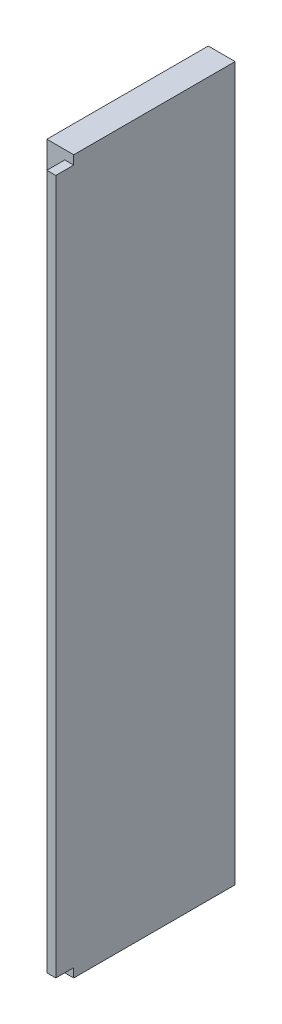
ISO-10303-21;
HEADER;
FILE_DESCRIPTION(('STEP AP214'),'2;1');
FILE_NAME('part.step','',(''),(''),'','','');
FILE_SCHEMA(('AUTOMOTIVE_DESIGN { 1 0 10303 214 1 1 1 1 }'));
ENDSEC;
DATA;
#1=APPLICATION_CONTEXT('core data for automotive mechanical design processes');
#2=APPLICATION_PROTOCOL_DEFINITION('international standard','automotive_design',2000,#1);
#3=PRODUCT_CONTEXT('',#1,'mechanical');
#4=PRODUCT('Part','Part','',(#3));
#5=PRODUCT_RELATED_PRODUCT_CATEGORY('part','',(#4));
#6=PRODUCT_DEFINITION_FORMATION('','',#4);
#7=PRODUCT_DEFINITION_CONTEXT('part definition',#1,'design');
#8=PRODUCT_DEFINITION('design','',#6,#7);
#9=PRODUCT_DEFINITION_SHAPE('','',#8);
#10=(LENGTH_UNIT() NAMED_UNIT(*) SI_UNIT(.MILLI.,.METRE.));
#11=(NAMED_UNIT(*) PLANE_ANGLE_UNIT() SI_UNIT($,.RADIAN.));
#12=(NAMED_UNIT(*) SI_UNIT($,.STERADIAN.) SOLID_ANGLE_UNIT());
#13=UNCERTAINTY_MEASURE_WITH_UNIT(LENGTH_MEASURE(1.E-05),#10,'distance_accuracy_value','');
#14=(GEOMETRIC_REPRESENTATION_CONTEXT(3) GLOBAL_UNCERTAINTY_ASSIGNED_CONTEXT((#13)) GLOBAL_UNIT_ASSIGNED_CONTEXT((#10,
#11,#12)) REPRESENTATION_CONTEXT('',''));
#15=CARTESIAN_POINT('',(0.,0.,0.));
#16=DIRECTION('',(0.,0.,1.));
#17=DIRECTION('',(1.,0.,0.));
#18=AXIS2_PLACEMENT_3D('',#15,#16,#17);
#19=CARTESIAN_POINT('',(0.,0.,0.));
#20=DIRECTION('',(0.,1.,0.));
#21=DIRECTION('',(0.,0.,1.));
#22=AXIS2_PLACEMENT_3D('',#19,#20,#21);
#23=PLANE('',#22);
#24=DIRECTION('',(-1.,0.,0.));
#25=VECTOR('',#24,1.);
#26=CARTESIAN_POINT('',(2.,0.,18.));
#27=LINE('',#26,#25);
#28=CARTESIAN_POINT('',(2.,0.,18.));
#29=VERTEX_POINT('',#28);
#30=CARTESIAN_POINT('',(0.,0.,18.));
#31=VERTEX_POINT('',#30);
#32=EDGE_CURVE('E225',#29,#31,#27,.T.);
#33=ORIENTED_EDGE('',*,*,#32,.F.);
#34=DIRECTION('',(0.,0.,-1.));
#35=VECTOR('',#34,1.);
#36=CARTESIAN_POINT('',(2.,0.,-18.));
#37=LINE('',#36,#35);
#38=CARTESIAN_POINT('',(2.,0.,22.));
#39=VERTEX_POINT('',#38);
#40=EDGE_CURVE('E402',#39,#29,#37,.T.);
#41=ORIENTED_EDGE('',*,*,#40,.F.);
#42=DIRECTION('',(1.,0.,0.));
#43=VECTOR('',#42,1.);
#44=CARTESIAN_POINT('',(2.,0.,22.));
#45=LINE('',#44,#43);
#46=CARTESIAN_POINT('',(0.,0.,22.));
#47=VERTEX_POINT('',#46);
#48=EDGE_CURVE('E399',#47,#39,#45,.T.);
#49=ORIENTED_EDGE('',*,*,#48,.F.);
#50=DIRECTION('',(0.,0.,1.));
#51=VECTOR('',#50,1.);
#52=CARTESIAN_POINT('',(0.,0.,22.));
#53=LINE('',#52,#51);
#54=EDGE_CURVE('E378',#31,#47,#53,.T.);
#55=ORIENTED_EDGE('',*,*,#54,.F.);
#56=EDGE_LOOP('',(#33,#41,#49,#55));
#57=FACE_BOUND('',#56,.T.);
#58=ADVANCED_FACE('F33',(#57),#23,.F.);
#59=CARTESIAN_POINT('',(0.,155.,22.));
#60=DIRECTION('',(1.,0.,0.));
#61=DIRECTION('',(0.,0.,-1.));
#62=AXIS2_PLACEMENT_3D('',#59,#60,#61);
#63=PLANE('',#62);
#64=ORIENTED_EDGE('',*,*,#54,.T.);
#65=DIRECTION('',(0.,-1.,0.));
#66=VECTOR('',#65,1.);
#67=CARTESIAN_POINT('',(0.,155.,22.));
#68=LINE('',#67,#66);
#69=CARTESIAN_POINT('',(0.,155.,22.));
#70=VERTEX_POINT('',#69);
#71=EDGE_CURVE('E37',#70,#47,#68,.T.);
#72=ORIENTED_EDGE('',*,*,#71,.F.);
#73=DIRECTION('',(0.,0.,1.));
#74=VECTOR('',#73,1.);
#75=CARTESIAN_POINT('',(0.,155.,22.));
#76=LINE('',#75,#74);
#77=CARTESIAN_POINT('',(0.,155.,18.));
#78=VERTEX_POINT('',#77);
#79=EDGE_CURVE('E379',#78,#70,#76,.T.);
#80=ORIENTED_EDGE('',*,*,#79,.F.);
#81=DIRECTION('',(0.,-1.,0.));
#82=VECTOR('',#81,1.);
#83=CARTESIAN_POINT('',(0.,155.,18.));
#84=LINE('',#83,#82);
#85=EDGE_CURVE('E396',#78,#31,#84,.T.);
#86=ORIENTED_EDGE('',*,*,#85,.T.);
#87=EDGE_LOOP('',(#64,#72,#80,#86));
#88=FACE_BOUND('',#87,.T.);
#89=ADVANCED_FACE('F35',(#88),#63,.F.);
#90=CARTESIAN_POINT('',(2.,155.,22.));
#91=DIRECTION('',(0.,0.,-1.));
#92=DIRECTION('',(-1.,0.,0.));
#93=AXIS2_PLACEMENT_3D('',#90,#91,#92);
#94=PLANE('',#93);
#95=ORIENTED_EDGE('',*,*,#48,.T.);
#96=DIRECTION('',(0.,-1.,0.));
#97=VECTOR('',#96,1.);
#98=CARTESIAN_POINT('',(2.,155.,22.));
#99=LINE('',#98,#97);
#100=CARTESIAN_POINT('',(2.,155.,22.));
#101=VERTEX_POINT('',#100);
#102=EDGE_CURVE('E433',#101,#39,#99,.T.);
#103=ORIENTED_EDGE('',*,*,#102,.F.);
#104=DIRECTION('',(1.,0.,0.));
#105=VECTOR('',#104,1.);
#106=CARTESIAN_POINT('',(2.,155.,22.));
#107=LINE('',#106,#105);
#108=EDGE_CURVE('E382',#70,#101,#107,.T.);
#109=ORIENTED_EDGE('',*,*,#108,.F.);
#110=ORIENTED_EDGE('',*,*,#71,.T.);
#111=EDGE_LOOP('',(#95,#103,#109,#110));
#112=FACE_BOUND('',#111,.T.);
#113=ADVANCED_FACE('F441',(#112),#94,.F.);
#114=CARTESIAN_POINT('',(2.,155.,-18.));
#115=DIRECTION('',(-1.,0.,0.));
#116=DIRECTION('',(0.,0.,1.));
#117=AXIS2_PLACEMENT_3D('',#114,#115,#116);
#118=PLANE('',#117);
#119=ORIENTED_EDGE('',*,*,#40,.T.);
#120=DIRECTION('',(0.,1.,0.));
#121=VECTOR('',#120,1.);
#122=CARTESIAN_POINT('',(2.,-2.,18.));
#123=LINE('',#122,#121);
#124=CARTESIAN_POINT('',(2.,-2.,18.));
#125=VERTEX_POINT('',#124);
#126=EDGE_CURVE('E356',#125,#29,#123,.T.);
#127=ORIENTED_EDGE('',*,*,#126,.F.);
#128=DIRECTION('',(0.,0.,1.));
#129=VECTOR('',#128,1.);
#130=CARTESIAN_POINT('',(2.,-2.,-18.));
#131=LINE('',#130,#129);
#132=CARTESIAN_POINT('',(2.,-2.,-18.));
#133=VERTEX_POINT('',#132);
#134=EDGE_CURVE('E343',#133,#125,#131,.T.);
#135=ORIENTED_EDGE('',*,*,#134,.F.);
#136=DIRECTION('',(0.,-1.,0.));
#137=VECTOR('',#136,1.);
#138=CARTESIAN_POINT('',(2.,155.,-18.));
#139=LINE('',#138,#137);
#140=CARTESIAN_POINT('',(2.,157.,-18.));
#141=VERTEX_POINT('',#140);
#142=EDGE_CURVE('E432',#141,#133,#139,.T.);
#143=ORIENTED_EDGE('',*,*,#142,.F.);
#144=DIRECTION('',(0.,0.,-1.));
#145=VECTOR('',#144,1.);
#146=CARTESIAN_POINT('',(2.,157.,-18.));
#147=LINE('',#146,#145);
#148=CARTESIAN_POINT('',(2.,157.,18.));
#149=VERTEX_POINT('',#148);
#150=EDGE_CURVE('E362',#149,#141,#147,.T.);
#151=ORIENTED_EDGE('',*,*,#150,.F.);
#152=DIRECTION('',(0.,-1.,0.));
#153=VECTOR('',#152,1.);
#154=CARTESIAN_POINT('',(2.,157.,18.));
#155=LINE('',#154,#153);
#156=CARTESIAN_POINT('',(2.,155.,18.));
#157=VERTEX_POINT('',#156);
#158=EDGE_CURVE('E373',#149,#157,#155,.T.);
#159=ORIENTED_EDGE('',*,*,#158,.T.);
#160=DIRECTION('',(0.,0.,-1.));
#161=VECTOR('',#160,1.);
#162=CARTESIAN_POINT('',(2.,155.,18.));
#163=LINE('',#162,#161);
#164=EDGE_CURVE('E385',#101,#157,#163,.T.);
#165=ORIENTED_EDGE('',*,*,#164,.F.);
#166=ORIENTED_EDGE('',*,*,#102,.T.);
#167=EDGE_LOOP('',(#119,#127,#135,#143,#151,#159,#165,#166));
#168=FACE_BOUND('',#167,.T.);
#169=ADVANCED_FACE('F449',(#168),#118,.F.);
#170=CARTESIAN_POINT('',(-4.,155.,-18.));
#171=DIRECTION('',(0.,0.,1.));
#172=DIRECTION('',(1.,0.,0.));
#173=AXIS2_PLACEMENT_3D('',#170,#171,#172);
#174=PLANE('',#173);
#175=ORIENTED_EDGE('',*,*,#142,.T.);
#176=DIRECTION('',(1.,0.,0.));
#177=VECTOR('',#176,1.);
#178=CARTESIAN_POINT('',(2.,-2.,-18.));
#179=LINE('',#178,#177);
#180=CARTESIAN_POINT('',(-3.99999999999999,-2.,-18.));
#181=VERTEX_POINT('',#180);
#182=EDGE_CURVE('E353',#181,#133,#179,.T.);
#183=ORIENTED_EDGE('',*,*,#182,.F.);
#184=DIRECTION('',(0.,-1.,0.));
#185=VECTOR('',#184,1.);
#186=CARTESIAN_POINT('',(-4.,155.,-18.));
#187=LINE('',#186,#185);
#188=CARTESIAN_POINT('',(-3.99999999999999,157.,-18.));
#189=VERTEX_POINT('',#188);
#190=EDGE_CURVE('E430',#189,#181,#187,.T.);
#191=ORIENTED_EDGE('',*,*,#190,.F.);
#192=DIRECTION('',(-1.,0.,0.));
#193=VECTOR('',#192,1.);
#194=CARTESIAN_POINT('',(2.,157.,-18.));
#195=LINE('',#194,#193);
#196=EDGE_CURVE('E365',#141,#189,#195,.T.);
#197=ORIENTED_EDGE('',*,*,#196,.F.);
#198=EDGE_LOOP('',(#175,#183,#191,#197));
#199=FACE_BOUND('',#198,.T.);
#200=ADVANCED_FACE('F458',(#199),#174,.F.);
#201=CARTESIAN_POINT('',(0.,155.,-16.));
#202=DIRECTION('',(0.,0.,-1.));
#203=DIRECTION('',(-1.,0.,0.));
#204=AXIS2_PLACEMENT_3D('',#201,#202,#203);
#205=PLANE('',#204);
#206=DIRECTION('',(1.,0.,0.));
#207=VECTOR('',#206,1.);
#208=CARTESIAN_POINT('',(0.,0.,-16.));
#209=LINE('',#208,#207);
#210=CARTESIAN_POINT('',(-3.99999999999999,0.,-16.));
#211=VERTEX_POINT('',#210);
#212=CARTESIAN_POINT('',(0.,0.,-16.));
#213=VERTEX_POINT('',#212);
#214=EDGE_CURVE('E405',#211,#213,#209,.T.);
#215=ORIENTED_EDGE('',*,*,#214,.T.);
#216=DIRECTION('',(0.,-1.,0.));
#217=VECTOR('',#216,1.);
#218=CARTESIAN_POINT('',(0.,155.,-16.));
#219=LINE('',#218,#217);
#220=CARTESIAN_POINT('',(0.,155.,-16.));
#221=VERTEX_POINT('',#220);
#222=EDGE_CURVE('E424',#221,#213,#219,.T.);
#223=ORIENTED_EDGE('',*,*,#222,.F.);
#224=DIRECTION('',(1.,0.,0.));
#225=VECTOR('',#224,1.);
#226=CARTESIAN_POINT('',(0.,155.,-16.));
#227=LINE('',#226,#225);
#228=CARTESIAN_POINT('',(-4.,155.,-16.));
#229=VERTEX_POINT('',#228);
#230=EDGE_CURVE('E387',#229,#221,#227,.T.);
#231=ORIENTED_EDGE('',*,*,#230,.F.);
#232=DIRECTION('',(0.,-1.,0.));
#233=VECTOR('',#232,1.);
#234=CARTESIAN_POINT('',(-4.,155.,-16.));
#235=LINE('',#234,#233);
#236=EDGE_CURVE('E427',#229,#211,#235,.T.);
#237=ORIENTED_EDGE('',*,*,#236,.T.);
#238=EDGE_LOOP('',(#215,#223,#231,#237));
#239=FACE_BOUND('',#238,.T.);
#240=ADVANCED_FACE('F493',(#239),#205,.F.);
#241=CARTESIAN_POINT('',(0.,155.,16.));
#242=DIRECTION('',(1.,0.,0.));
#243=DIRECTION('',(0.,0.,-1.));
#244=AXIS2_PLACEMENT_3D('',#241,#242,#243);
#245=PLANE('',#244);
#246=DIRECTION('',(0.,0.,1.));
#247=VECTOR('',#246,1.);
#248=CARTESIAN_POINT('',(0.,0.,16.));
#249=LINE('',#248,#247);
#250=CARTESIAN_POINT('',(0.,0.,-12.5));
#251=VERTEX_POINT('',#250);
#252=EDGE_CURVE('E409',#213,#251,#249,.T.);
#253=ORIENTED_EDGE('',*,*,#252,.T.);
#254=DIRECTION('',(0.,1.,0.));
#255=VECTOR('',#254,1.);
#256=CARTESIAN_POINT('',(0.,-2.001,-12.5));
#257=LINE('',#256,#255);
#258=CARTESIAN_POINT('',(0.,-2.,-12.5));
#259=VERTEX_POINT('',#258);
#260=EDGE_CURVE('E333',#259,#251,#257,.T.);
#261=ORIENTED_EDGE('',*,*,#260,.F.);
#262=DIRECTION('',(0.,0.,-1.));
#263=VECTOR('',#262,1.);
#264=CARTESIAN_POINT('',(0.,-2.,-9.50000000000001));
#265=LINE('',#264,#263);
#266=CARTESIAN_POINT('',(0.,-2.,-9.50000000000001));
#267=VERTEX_POINT('',#266);
#268=EDGE_CURVE('E321',#267,#259,#265,.T.);
#269=ORIENTED_EDGE('',*,*,#268,.F.);
#270=DIRECTION('',(0.,1.,0.));
#271=VECTOR('',#270,1.);
#272=CARTESIAN_POINT('',(0.,-2.001,-9.50000000000001));
#273=LINE('',#272,#271);
#274=CARTESIAN_POINT('',(0.,0.,-9.50000000000001));
#275=VERTEX_POINT('',#274);
#276=EDGE_CURVE('E334',#267,#275,#273,.T.);
#277=ORIENTED_EDGE('',*,*,#276,.T.);
#278=CARTESIAN_POINT('',(0.,0.,-5.16666666666667));
#279=VERTEX_POINT('',#278);
#280=EDGE_CURVE('E411',#275,#279,#249,.T.);
#281=ORIENTED_EDGE('',*,*,#280,.T.);
#282=DIRECTION('',(0.,1.,0.));
#283=VECTOR('',#282,1.);
#284=CARTESIAN_POINT('',(0.,-2.001,-5.16666666666667));
#285=LINE('',#284,#283);
#286=CARTESIAN_POINT('',(0.,-2.,-5.16666666666667));
#287=VERTEX_POINT('',#286);
#288=EDGE_CURVE('E305',#287,#279,#285,.T.);
#289=ORIENTED_EDGE('',*,*,#288,.F.);
#290=DIRECTION('',(0.,0.,-1.));
#291=VECTOR('',#290,1.);
#292=CARTESIAN_POINT('',(0.,-2.,-2.16666666666667));
#293=LINE('',#292,#291);
#294=CARTESIAN_POINT('',(0.,-2.,-2.16666666666667));
#295=VERTEX_POINT('',#294);
#296=EDGE_CURVE('E293',#295,#287,#293,.T.);
#297=ORIENTED_EDGE('',*,*,#296,.F.);
#298=DIRECTION('',(0.,1.,0.));
#299=VECTOR('',#298,1.);
#300=CARTESIAN_POINT('',(0.,-2.001,-2.16666666666667));
#301=LINE('',#300,#299);
#302=CARTESIAN_POINT('',(0.,0.,-2.16666666666667));
#303=VERTEX_POINT('',#302);
#304=EDGE_CURVE('E306',#295,#303,#301,.T.);
#305=ORIENTED_EDGE('',*,*,#304,.T.);
#306=CARTESIAN_POINT('',(0.,0.,2.16666666666667));
#307=VERTEX_POINT('',#306);
#308=EDGE_CURVE('E775',#303,#307,#249,.T.);
#309=ORIENTED_EDGE('',*,*,#308,.T.);
#310=DIRECTION('',(0.,1.,0.));
#311=VECTOR('',#310,1.);
#312=CARTESIAN_POINT('',(0.,-2.001,2.16666666666667));
#313=LINE('',#312,#311);
#314=CARTESIAN_POINT('',(0.,-2.,2.16666666666667));
#315=VERTEX_POINT('',#314);
#316=EDGE_CURVE('E276',#315,#307,#313,.T.);
#317=ORIENTED_EDGE('',*,*,#316,.F.);
#318=DIRECTION('',(0.,0.,-1.));
#319=VECTOR('',#318,1.);
#320=CARTESIAN_POINT('',(0.,-2.,5.16666666666667));
#321=LINE('',#320,#319);
#322=CARTESIAN_POINT('',(0.,-2.,5.16666666666667));
#323=VERTEX_POINT('',#322);
#324=EDGE_CURVE('E265',#323,#315,#321,.T.);
#325=ORIENTED_EDGE('',*,*,#324,.F.);
#326=DIRECTION('',(0.,1.,0.));
#327=VECTOR('',#326,1.);
#328=CARTESIAN_POINT('',(0.,-2.001,5.16666666666667));
#329=LINE('',#328,#327);
#330=CARTESIAN_POINT('',(0.,0.,5.16666666666667));
#331=VERTEX_POINT('',#330);
#332=EDGE_CURVE('E277',#323,#331,#329,.T.);
#333=ORIENTED_EDGE('',*,*,#332,.T.);
#334=CARTESIAN_POINT('',(0.,0.,9.5));
#335=VERTEX_POINT('',#334);
#336=EDGE_CURVE('E235',#331,#335,#249,.T.);
#337=ORIENTED_EDGE('',*,*,#336,.T.);
#338=DIRECTION('',(0.,1.,0.));
#339=VECTOR('',#338,1.);
#340=CARTESIAN_POINT('',(0.,-2.001,9.50000000000001));
#341=LINE('',#340,#339);
#342=CARTESIAN_POINT('',(0.,-2.,9.50000000000001));
#343=VERTEX_POINT('',#342);
#344=EDGE_CURVE('E220',#343,#335,#341,.T.);
#345=ORIENTED_EDGE('',*,*,#344,.F.);
#346=DIRECTION('',(0.,0.,-1.));
#347=VECTOR('',#346,1.);
#348=CARTESIAN_POINT('',(0.,-2.,12.5));
#349=LINE('',#348,#347);
#350=CARTESIAN_POINT('',(0.,-2.,12.5));
#351=VERTEX_POINT('',#350);
#352=EDGE_CURVE('E232',#351,#343,#349,.T.);
#353=ORIENTED_EDGE('',*,*,#352,.F.);
#354=DIRECTION('',(0.,1.,0.));
#355=VECTOR('',#354,1.);
#356=CARTESIAN_POINT('',(0.,-2.001,12.5));
#357=LINE('',#356,#355);
#358=CARTESIAN_POINT('',(0.,0.,12.5));
#359=VERTEX_POINT('',#358);
#360=EDGE_CURVE('E226',#351,#359,#357,.T.);
#361=ORIENTED_EDGE('',*,*,#360,.T.);
#362=CARTESIAN_POINT('',(0.,0.,16.));
#363=VERTEX_POINT('',#362);
#364=EDGE_CURVE('E408',#359,#363,#249,.T.);
#365=ORIENTED_EDGE('',*,*,#364,.T.);
#366=DIRECTION('',(0.,-1.,0.));
#367=VECTOR('',#366,1.);
#368=CARTESIAN_POINT('',(0.,155.,16.));
#369=LINE('',#368,#367);
#370=CARTESIAN_POINT('',(0.,155.,16.));
#371=VERTEX_POINT('',#370);
#372=EDGE_CURVE('E421',#371,#363,#369,.T.);
#373=ORIENTED_EDGE('',*,*,#372,.F.);
#374=DIRECTION('',(0.,0.,1.));
#375=VECTOR('',#374,1.);
#376=CARTESIAN_POINT('',(0.,155.,16.));
#377=LINE('',#376,#375);
#378=EDGE_CURVE('E390',#221,#371,#377,.T.);
#379=ORIENTED_EDGE('',*,*,#378,.F.);
#380=ORIENTED_EDGE('',*,*,#222,.T.);
#381=EDGE_LOOP('',(#253,#261,#269,#277,#281,#289,#297,#305,#309,#317,#325,#333,#337,#345,#353,
#361,#365,#373,#379,#380));
#382=FACE_BOUND('',#381,.T.);
#383=ADVANCED_FACE('F231',(#382),#245,.F.);
#384=CARTESIAN_POINT('',(-3.99999999999999,155.,16.));
#385=DIRECTION('',(0.,0.,1.));
#386=DIRECTION('',(1.,0.,0.));
#387=AXIS2_PLACEMENT_3D('',#384,#385,#386);
#388=PLANE('',#387);
#389=DIRECTION('',(-1.,0.,0.));
#390=VECTOR('',#389,1.);
#391=CARTESIAN_POINT('',(-3.99999999999999,0.,16.));
#392=LINE('',#391,#390);
#393=CARTESIAN_POINT('',(-3.99999999999999,0.,16.));
#394=VERTEX_POINT('',#393);
#395=EDGE_CURVE('E383',#363,#394,#392,.T.);
#396=ORIENTED_EDGE('',*,*,#395,.T.);
#397=DIRECTION('',(0.,-1.,0.));
#398=VECTOR('',#397,1.);
#399=CARTESIAN_POINT('',(-3.99999999999999,155.,16.));
#400=LINE('',#399,#398);
#401=CARTESIAN_POINT('',(-3.99999999999999,155.,16.));
#402=VERTEX_POINT('',#401);
#403=EDGE_CURVE('E418',#402,#394,#400,.T.);
#404=ORIENTED_EDGE('',*,*,#403,.F.);
#405=DIRECTION('',(-1.,0.,0.));
#406=VECTOR('',#405,1.);
#407=CARTESIAN_POINT('',(-3.99999999999999,155.,16.));
#408=LINE('',#407,#406);
#409=EDGE_CURVE('E393',#371,#402,#408,.T.);
#410=ORIENTED_EDGE('',*,*,#409,.F.);
#411=ORIENTED_EDGE('',*,*,#372,.T.);
#412=EDGE_LOOP('',(#396,#404,#410,#411));
#413=FACE_BOUND('',#412,.T.);
#414=ADVANCED_FACE('F486',(#413),#388,.F.);
#415=CARTESIAN_POINT('',(-3.99999999999999,155.,18.));
#416=DIRECTION('',(1.,0.,0.));
#417=DIRECTION('',(0.,0.,-1.));
#418=AXIS2_PLACEMENT_3D('',#415,#416,#417);
#419=PLANE('',#418);
#420=DIRECTION('',(0.,0.,-1.));
#421=VECTOR('',#420,1.);
#422=CARTESIAN_POINT('',(-3.99999999999999,-2.,-18.));
#423=LINE('',#422,#421);
#424=CARTESIAN_POINT('',(-3.99999999999999,-2.,18.));
#425=VERTEX_POINT('',#424);
#426=EDGE_CURVE('E350',#425,#181,#423,.T.);
#427=ORIENTED_EDGE('',*,*,#426,.F.);
#428=DIRECTION('',(0.,-1.,0.));
#429=VECTOR('',#428,1.);
#430=CARTESIAN_POINT('',(-3.99999999999999,155.,18.));
#431=LINE('',#430,#429);
#432=CARTESIAN_POINT('',(-3.99999999999999,157.,18.));
#433=VERTEX_POINT('',#432);
#434=EDGE_CURVE('E416',#433,#425,#431,.T.);
#435=ORIENTED_EDGE('',*,*,#434,.F.);
#436=DIRECTION('',(0.,0.,1.));
#437=VECTOR('',#436,1.);
#438=CARTESIAN_POINT('',(-3.99999999999999,157.,-18.));
#439=LINE('',#438,#437);
#440=EDGE_CURVE('E368',#189,#433,#439,.T.);
#441=ORIENTED_EDGE('',*,*,#440,.F.);
#442=ORIENTED_EDGE('',*,*,#190,.T.);
#443=EDGE_LOOP('',(#427,#435,#441,#442));
#444=FACE_BOUND('',#443,.T.);
#445=ORIENTED_EDGE('',*,*,#403,.T.);
#446=DIRECTION('',(0.,0.,-1.));
#447=VECTOR('',#446,1.);
#448=CARTESIAN_POINT('',(-3.99999999999999,0.,-18.));
#449=LINE('',#448,#447);
#450=EDGE_CURVE('E347',#394,#211,#449,.T.);
#451=ORIENTED_EDGE('',*,*,#450,.T.);
#452=ORIENTED_EDGE('',*,*,#236,.F.);
#453=DIRECTION('',(0.,0.,1.));
#454=VECTOR('',#453,1.);
#455=CARTESIAN_POINT('',(-3.99999999999999,155.,-18.));
#456=LINE('',#455,#454);
#457=EDGE_CURVE('E361',#229,#402,#456,.T.);
#458=ORIENTED_EDGE('',*,*,#457,.T.);
#459=EDGE_LOOP('',(#445,#451,#452,#458));
#460=FACE_BOUND('',#459,.T.);
#461=ADVANCED_FACE('F475',(#444,#460),#419,.F.);
#462=CARTESIAN_POINT('',(0.,155.,18.));
#463=DIRECTION('',(0.,0.,-1.));
#464=DIRECTION('',(-1.,0.,0.));
#465=AXIS2_PLACEMENT_3D('',#462,#463,#464);
#466=PLANE('',#465);
#467=ORIENTED_EDGE('',*,*,#434,.T.);
#468=DIRECTION('',(-1.,0.,0.));
#469=VECTOR('',#468,1.);
#470=CARTESIAN_POINT('',(2.,-2.,18.));
#471=LINE('',#470,#469);
#472=EDGE_CURVE('E346',#125,#425,#471,.T.);
#473=ORIENTED_EDGE('',*,*,#472,.F.);
#474=ORIENTED_EDGE('',*,*,#126,.T.);
#475=ORIENTED_EDGE('',*,*,#32,.T.);
#476=ORIENTED_EDGE('',*,*,#85,.F.);
#477=DIRECTION('',(1.,0.,0.));
#478=VECTOR('',#477,1.);
#479=CARTESIAN_POINT('',(2.,155.,18.));
#480=LINE('',#479,#478);
#481=EDGE_CURVE('E11',#78,#157,#480,.T.);
#482=ORIENTED_EDGE('',*,*,#481,.T.);
#483=ORIENTED_EDGE('',*,*,#158,.F.);
#484=DIRECTION('',(1.,0.,0.));
#485=VECTOR('',#484,1.);
#486=CARTESIAN_POINT('',(2.,157.,18.));
#487=LINE('',#486,#485);
#488=EDGE_CURVE('E371',#433,#149,#487,.T.);
#489=ORIENTED_EDGE('',*,*,#488,.F.);
#490=EDGE_LOOP('',(#467,#473,#474,#475,#476,#482,#483,#489));
#491=FACE_BOUND('',#490,.T.);
#492=ADVANCED_FACE('F452',(#491),#466,.F.);
#493=CARTESIAN_POINT('',(0.,155.,0.));
#494=DIRECTION('',(0.,1.,0.));
#495=DIRECTION('',(0.,0.,1.));
#496=AXIS2_PLACEMENT_3D('',#493,#494,#495);
#497=PLANE('',#496);
#498=ORIENTED_EDGE('',*,*,#481,.F.);
#499=ORIENTED_EDGE('',*,*,#79,.T.);
#500=ORIENTED_EDGE('',*,*,#108,.T.);
#501=ORIENTED_EDGE('',*,*,#164,.T.);
#502=EDGE_LOOP('',(#498,#499,#500,#501));
#503=FACE_BOUND('',#502,.T.);
#504=ADVANCED_FACE('F466',(#503),#497,.T.);
#505=CARTESIAN_POINT('',(0.,157.,0.));
#506=DIRECTION('',(0.,-1.,0.));
#507=DIRECTION('',(0.,0.,-1.));
#508=AXIS2_PLACEMENT_3D('',#505,#506,#507);
#509=PLANE('',#508);
#510=ORIENTED_EDGE('',*,*,#150,.T.);
#511=ORIENTED_EDGE('',*,*,#196,.T.);
#512=ORIENTED_EDGE('',*,*,#440,.T.);
#513=ORIENTED_EDGE('',*,*,#488,.T.);
#514=EDGE_LOOP('',(#510,#511,#512,#513));
#515=FACE_BOUND('',#514,.T.);
#516=ADVANCED_FACE('F463',(#515),#509,.F.);
#517=CARTESIAN_POINT('',(0.,155.,0.));
#518=DIRECTION('',(0.,-1.,0.));
#519=DIRECTION('',(0.,0.,-1.));
#520=AXIS2_PLACEMENT_3D('',#517,#518,#519);
#521=PLANE('',#520);
#522=ORIENTED_EDGE('',*,*,#457,.F.);
#523=ORIENTED_EDGE('',*,*,#230,.T.);
#524=ORIENTED_EDGE('',*,*,#378,.T.);
#525=ORIENTED_EDGE('',*,*,#409,.T.);
#526=EDGE_LOOP('',(#522,#523,#524,#525));
#527=FACE_BOUND('',#526,.T.);
#528=ADVANCED_FACE('F473',(#527),#521,.T.);
#529=CARTESIAN_POINT('',(0.,-2.,0.));
#530=DIRECTION('',(0.,-1.,0.));
#531=DIRECTION('',(0.,0.,-1.));
#532=AXIS2_PLACEMENT_3D('',#529,#530,#531);
#533=PLANE('',#532);
#534=ORIENTED_EDGE('',*,*,#352,.T.);
#535=DIRECTION('',(-1.,0.,0.));
#536=VECTOR('',#535,1.);
#537=CARTESIAN_POINT('',(0.,-2.,9.50000000000001));
#538=LINE('',#537,#536);
#539=CARTESIAN_POINT('',(-2.99999999999999,-2.,9.5));
#540=VERTEX_POINT('',#539);
#541=EDGE_CURVE('E217',#343,#540,#538,.T.);
#542=ORIENTED_EDGE('',*,*,#541,.T.);
#543=DIRECTION('',(0.,0.,1.));
#544=VECTOR('',#543,1.);
#545=CARTESIAN_POINT('',(-2.99999999999999,-2.,12.5));
#546=LINE('',#545,#544);
#547=CARTESIAN_POINT('',(-2.99999999999999,-2.,12.5));
#548=VERTEX_POINT('',#547);
#549=EDGE_CURVE('E246',#540,#548,#546,.T.);
#550=ORIENTED_EDGE('',*,*,#549,.T.);
#551=DIRECTION('',(1.,0.,0.));
#552=VECTOR('',#551,1.);
#553=CARTESIAN_POINT('',(0.,-2.,12.5));
#554=LINE('',#553,#552);
#555=EDGE_CURVE('E241',#548,#351,#554,.T.);
#556=ORIENTED_EDGE('',*,*,#555,.T.);
#557=EDGE_LOOP('',(#534,#542,#550,#556));
#558=FACE_BOUND('',#557,.T.);
#559=ORIENTED_EDGE('',*,*,#324,.T.);
#560=DIRECTION('',(-1.,0.,0.));
#561=VECTOR('',#560,1.);
#562=CARTESIAN_POINT('',(0.,-2.,2.16666666666667));
#563=LINE('',#562,#561);
#564=CARTESIAN_POINT('',(-2.99999999999999,-2.,2.16666666666667));
#565=VERTEX_POINT('',#564);
#566=EDGE_CURVE('E279',#315,#565,#563,.T.);
#567=ORIENTED_EDGE('',*,*,#566,.T.);
#568=DIRECTION('',(0.,0.,1.));
#569=VECTOR('',#568,1.);
#570=CARTESIAN_POINT('',(-2.99999999999999,-2.,5.16666666666667));
#571=LINE('',#570,#569);
#572=CARTESIAN_POINT('',(-2.99999999999999,-2.,5.16666666666667));
#573=VERTEX_POINT('',#572);
#574=EDGE_CURVE('E258',#565,#573,#571,.T.);
#575=ORIENTED_EDGE('',*,*,#574,.T.);
#576=DIRECTION('',(1.,0.,0.));
#577=VECTOR('',#576,1.);
#578=CARTESIAN_POINT('',(0.,-2.,5.16666666666667));
#579=LINE('',#578,#577);
#580=EDGE_CURVE('E261',#573,#323,#579,.T.);
#581=ORIENTED_EDGE('',*,*,#580,.T.);
#582=EDGE_LOOP('',(#559,#567,#575,#581));
#583=FACE_BOUND('',#582,.T.);
#584=ORIENTED_EDGE('',*,*,#296,.T.);
#585=DIRECTION('',(-1.,0.,0.));
#586=VECTOR('',#585,1.);
#587=CARTESIAN_POINT('',(0.,-2.,-5.16666666666667));
#588=LINE('',#587,#586);
#589=CARTESIAN_POINT('',(-2.99999999999999,-2.,-5.16666666666667));
#590=VERTEX_POINT('',#589);
#591=EDGE_CURVE('E262',#287,#590,#588,.T.);
#592=ORIENTED_EDGE('',*,*,#591,.T.);
#593=DIRECTION('',(0.,0.,1.));
#594=VECTOR('',#593,1.);
#595=CARTESIAN_POINT('',(-2.99999999999999,-2.,-2.16666666666667));
#596=LINE('',#595,#594);
#597=CARTESIAN_POINT('',(-2.99999999999999,-2.,-2.16666666666667));
#598=VERTEX_POINT('',#597);
#599=EDGE_CURVE('E286',#590,#598,#596,.T.);
#600=ORIENTED_EDGE('',*,*,#599,.T.);
#601=DIRECTION('',(1.,0.,0.));
#602=VECTOR('',#601,1.);
#603=CARTESIAN_POINT('',(0.,-2.,-2.16666666666667));
#604=LINE('',#603,#602);
#605=EDGE_CURVE('E289',#598,#295,#604,.T.);
#606=ORIENTED_EDGE('',*,*,#605,.T.);
#607=EDGE_LOOP('',(#584,#592,#600,#606));
#608=FACE_BOUND('',#607,.T.);
#609=ORIENTED_EDGE('',*,*,#268,.T.);
#610=DIRECTION('',(-1.,0.,0.));
#611=VECTOR('',#610,1.);
#612=CARTESIAN_POINT('',(0.,-2.,-12.5));
#613=LINE('',#612,#611);
#614=CARTESIAN_POINT('',(-2.99999999999999,-2.,-12.5));
#615=VERTEX_POINT('',#614);
#616=EDGE_CURVE('E290',#259,#615,#613,.T.);
#617=ORIENTED_EDGE('',*,*,#616,.T.);
#618=DIRECTION('',(0.,0.,1.));
#619=VECTOR('',#618,1.);
#620=CARTESIAN_POINT('',(-2.99999999999999,-2.,-9.5));
#621=LINE('',#620,#619);
#622=CARTESIAN_POINT('',(-2.99999999999999,-2.,-9.5));
#623=VERTEX_POINT('',#622);
#624=EDGE_CURVE('E315',#615,#623,#621,.T.);
#625=ORIENTED_EDGE('',*,*,#624,.T.);
#626=DIRECTION('',(1.,0.,0.));
#627=VECTOR('',#626,1.);
#628=CARTESIAN_POINT('',(0.,-2.,-9.50000000000001));
#629=LINE('',#628,#627);
#630=EDGE_CURVE('E318',#623,#267,#629,.T.);
#631=ORIENTED_EDGE('',*,*,#630,.T.);
#632=EDGE_LOOP('',(#609,#617,#625,#631));
#633=FACE_BOUND('',#632,.T.);
#634=ORIENTED_EDGE('',*,*,#134,.T.);
#635=ORIENTED_EDGE('',*,*,#472,.T.);
#636=ORIENTED_EDGE('',*,*,#426,.T.);
#637=ORIENTED_EDGE('',*,*,#182,.T.);
#638=EDGE_LOOP('',(#634,#635,#636,#637));
#639=FACE_BOUND('',#638,.T.);
#640=ADVANCED_FACE('F239',(#558,#583,#608,#633,#639),#533,.T.);
#641=CARTESIAN_POINT('',(0.,0.,0.));
#642=DIRECTION('',(0.,-1.,0.));
#643=DIRECTION('',(0.,0.,-1.));
#644=AXIS2_PLACEMENT_3D('',#641,#642,#643);
#645=PLANE('',#644);
#646=ORIENTED_EDGE('',*,*,#364,.F.);
#647=DIRECTION('',(1.,0.,0.));
#648=VECTOR('',#647,1.);
#649=CARTESIAN_POINT('',(0.,0.,12.5));
#650=LINE('',#649,#648);
#651=CARTESIAN_POINT('',(-2.99999999999999,0.,12.5));
#652=VERTEX_POINT('',#651);
#653=EDGE_CURVE('E236',#652,#359,#650,.T.);
#654=ORIENTED_EDGE('',*,*,#653,.F.);
#655=DIRECTION('',(0.,0.,1.));
#656=VECTOR('',#655,1.);
#657=CARTESIAN_POINT('',(-2.99999999999999,0.,12.5));
#658=LINE('',#657,#656);
#659=CARTESIAN_POINT('',(-2.99999999999999,0.,9.5));
#660=VERTEX_POINT('',#659);
#661=EDGE_CURVE('E244',#660,#652,#658,.T.);
#662=ORIENTED_EDGE('',*,*,#661,.F.);
#663=DIRECTION('',(-1.,0.,0.));
#664=VECTOR('',#663,1.);
#665=CARTESIAN_POINT('',(0.,0.,9.50000000000001));
#666=LINE('',#665,#664);
#667=EDGE_CURVE('E242',#335,#660,#666,.T.);
#668=ORIENTED_EDGE('',*,*,#667,.F.);
#669=ORIENTED_EDGE('',*,*,#336,.F.);
#670=DIRECTION('',(1.,0.,0.));
#671=VECTOR('',#670,1.);
#672=CARTESIAN_POINT('',(0.,0.,5.16666666666667));
#673=LINE('',#672,#671);
#674=CARTESIAN_POINT('',(-2.99999999999999,0.,5.16666666666667));
#675=VERTEX_POINT('',#674);
#676=EDGE_CURVE('E273',#675,#331,#673,.T.);
#677=ORIENTED_EDGE('',*,*,#676,.F.);
#678=DIRECTION('',(0.,0.,1.));
#679=VECTOR('',#678,1.);
#680=CARTESIAN_POINT('',(-2.99999999999999,0.,5.16666666666667));
#681=LINE('',#680,#679);
#682=CARTESIAN_POINT('',(-2.99999999999999,0.,2.16666666666667));
#683=VERTEX_POINT('',#682);
#684=EDGE_CURVE('E270',#683,#675,#681,.T.);
#685=ORIENTED_EDGE('',*,*,#684,.F.);
#686=DIRECTION('',(-1.,0.,0.));
#687=VECTOR('',#686,1.);
#688=CARTESIAN_POINT('',(0.,0.,2.16666666666667));
#689=LINE('',#688,#687);
#690=EDGE_CURVE('E268',#307,#683,#689,.T.);
#691=ORIENTED_EDGE('',*,*,#690,.F.);
#692=ORIENTED_EDGE('',*,*,#308,.F.);
#693=DIRECTION('',(1.,0.,0.));
#694=VECTOR('',#693,1.);
#695=CARTESIAN_POINT('',(0.,0.,-2.16666666666667));
#696=LINE('',#695,#694);
#697=CARTESIAN_POINT('',(-2.99999999999999,0.,-2.16666666666667));
#698=VERTEX_POINT('',#697);
#699=EDGE_CURVE('E302',#698,#303,#696,.T.);
#700=ORIENTED_EDGE('',*,*,#699,.F.);
#701=DIRECTION('',(0.,0.,1.));
#702=VECTOR('',#701,1.);
#703=CARTESIAN_POINT('',(-2.99999999999999,0.,-2.16666666666667));
#704=LINE('',#703,#702);
#705=CARTESIAN_POINT('',(-2.99999999999999,0.,-5.16666666666667));
#706=VERTEX_POINT('',#705);
#707=EDGE_CURVE('E299',#706,#698,#704,.T.);
#708=ORIENTED_EDGE('',*,*,#707,.F.);
#709=DIRECTION('',(-1.,0.,0.));
#710=VECTOR('',#709,1.);
#711=CARTESIAN_POINT('',(0.,0.,-5.16666666666667));
#712=LINE('',#711,#710);
#713=EDGE_CURVE('E296',#279,#706,#712,.T.);
#714=ORIENTED_EDGE('',*,*,#713,.F.);
#715=ORIENTED_EDGE('',*,*,#280,.F.);
#716=DIRECTION('',(1.,0.,0.));
#717=VECTOR('',#716,1.);
#718=CARTESIAN_POINT('',(0.,0.,-9.50000000000001));
#719=LINE('',#718,#717);
#720=CARTESIAN_POINT('',(-2.99999999999999,0.,-9.5));
#721=VERTEX_POINT('',#720);
#722=EDGE_CURVE('E330',#721,#275,#719,.T.);
#723=ORIENTED_EDGE('',*,*,#722,.F.);
#724=DIRECTION('',(0.,0.,1.));
#725=VECTOR('',#724,1.);
#726=CARTESIAN_POINT('',(-2.99999999999999,0.,-9.5));
#727=LINE('',#726,#725);
#728=CARTESIAN_POINT('',(-2.99999999999999,0.,-12.5));
#729=VERTEX_POINT('',#728);
#730=EDGE_CURVE('E327',#729,#721,#727,.T.);
#731=ORIENTED_EDGE('',*,*,#730,.F.);
#732=DIRECTION('',(-1.,0.,0.));
#733=VECTOR('',#732,1.);
#734=CARTESIAN_POINT('',(0.,0.,-12.5));
#735=LINE('',#734,#733);
#736=EDGE_CURVE('E324',#251,#729,#735,.T.);
#737=ORIENTED_EDGE('',*,*,#736,.F.);
#738=ORIENTED_EDGE('',*,*,#252,.F.);
#739=ORIENTED_EDGE('',*,*,#214,.F.);
#740=ORIENTED_EDGE('',*,*,#450,.F.);
#741=ORIENTED_EDGE('',*,*,#395,.F.);
#742=EDGE_LOOP('',(#646,#654,#662,#668,#669,#677,#685,#691,#692,#700,#708,#714,#715,#723,#731,
#737,#738,#739,#740,#741));
#743=FACE_BOUND('',#742,.T.);
#744=ADVANCED_FACE('F551',(#743),#645,.F.);
#745=CARTESIAN_POINT('',(0.,-2.001,-9.50000000000001));
#746=DIRECTION('',(0.,0.,1.));
#747=DIRECTION('',(1.,0.,0.));
#748=AXIS2_PLACEMENT_3D('',#745,#746,#747);
#749=PLANE('',#748);
#750=DIRECTION('',(0.,1.,0.));
#751=VECTOR('',#750,1.);
#752=CARTESIAN_POINT('',(-2.99999999999999,-2.001,-9.5));
#753=LINE('',#752,#751);
#754=EDGE_CURVE('E336',#623,#721,#753,.T.);
#755=ORIENTED_EDGE('',*,*,#754,.T.);
#756=ORIENTED_EDGE('',*,*,#722,.T.);
#757=ORIENTED_EDGE('',*,*,#276,.F.);
#758=ORIENTED_EDGE('',*,*,#630,.F.);
#759=EDGE_LOOP('',(#755,#756,#757,#758));
#760=FACE_BOUND('',#759,.T.);
#761=ADVANCED_FACE('F559',(#760),#749,.F.);
#762=CARTESIAN_POINT('',(-2.99999999999999,-2.001,-9.5));
#763=DIRECTION('',(-1.,0.,0.));
#764=DIRECTION('',(0.,0.,1.));
#765=AXIS2_PLACEMENT_3D('',#762,#763,#764);
#766=PLANE('',#765);
#767=DIRECTION('',(0.,1.,0.));
#768=VECTOR('',#767,1.);
#769=CARTESIAN_POINT('',(-2.99999999999999,-2.001,-12.5));
#770=LINE('',#769,#768);
#771=EDGE_CURVE('E338',#615,#729,#770,.T.);
#772=ORIENTED_EDGE('',*,*,#771,.T.);
#773=ORIENTED_EDGE('',*,*,#730,.T.);
#774=ORIENTED_EDGE('',*,*,#754,.F.);
#775=ORIENTED_EDGE('',*,*,#624,.F.);
#776=EDGE_LOOP('',(#772,#773,#774,#775));
#777=FACE_BOUND('',#776,.T.);
#778=ADVANCED_FACE('F582',(#777),#766,.F.);
#779=CARTESIAN_POINT('',(0.,-2.001,-12.5));
#780=DIRECTION('',(0.,0.,-1.));
#781=DIRECTION('',(-1.,0.,0.));
#782=AXIS2_PLACEMENT_3D('',#779,#780,#781);
#783=PLANE('',#782);
#784=ORIENTED_EDGE('',*,*,#260,.T.);
#785=ORIENTED_EDGE('',*,*,#736,.T.);
#786=ORIENTED_EDGE('',*,*,#771,.F.);
#787=ORIENTED_EDGE('',*,*,#616,.F.);
#788=EDGE_LOOP('',(#784,#785,#786,#787));
#789=FACE_BOUND('',#788,.T.);
#790=ADVANCED_FACE('F591',(#789),#783,.F.);
#791=CARTESIAN_POINT('',(0.,-2.001,-2.16666666666667));
#792=DIRECTION('',(0.,0.,1.));
#793=DIRECTION('',(1.,0.,0.));
#794=AXIS2_PLACEMENT_3D('',#791,#792,#793);
#795=PLANE('',#794);
#796=DIRECTION('',(0.,1.,0.));
#797=VECTOR('',#796,1.);
#798=CARTESIAN_POINT('',(-2.99999999999999,-2.001,-2.16666666666667));
#799=LINE('',#798,#797);
#800=EDGE_CURVE('E308',#598,#698,#799,.T.);
#801=ORIENTED_EDGE('',*,*,#800,.T.);
#802=ORIENTED_EDGE('',*,*,#699,.T.);
#803=ORIENTED_EDGE('',*,*,#304,.F.);
#804=ORIENTED_EDGE('',*,*,#605,.F.);
#805=EDGE_LOOP('',(#801,#802,#803,#804));
#806=FACE_BOUND('',#805,.T.);
#807=ADVANCED_FACE('F600',(#806),#795,.F.);
#808=CARTESIAN_POINT('',(-2.99999999999999,-2.001,-2.16666666666667));
#809=DIRECTION('',(-1.,0.,0.));
#810=DIRECTION('',(0.,0.,1.));
#811=AXIS2_PLACEMENT_3D('',#808,#809,#810);
#812=PLANE('',#811);
#813=DIRECTION('',(0.,1.,0.));
#814=VECTOR('',#813,1.);
#815=CARTESIAN_POINT('',(-2.99999999999999,-2.001,-5.16666666666667));
#816=LINE('',#815,#814);
#817=EDGE_CURVE('E310',#590,#706,#816,.T.);
#818=ORIENTED_EDGE('',*,*,#817,.T.);
#819=ORIENTED_EDGE('',*,*,#707,.T.);
#820=ORIENTED_EDGE('',*,*,#800,.F.);
#821=ORIENTED_EDGE('',*,*,#599,.F.);
#822=EDGE_LOOP('',(#818,#819,#820,#821));
#823=FACE_BOUND('',#822,.T.);
#824=ADVANCED_FACE('F609',(#823),#812,.F.);
#825=CARTESIAN_POINT('',(0.,-2.001,-5.16666666666667));
#826=DIRECTION('',(0.,0.,-1.));
#827=DIRECTION('',(-1.,0.,0.));
#828=AXIS2_PLACEMENT_3D('',#825,#826,#827);
#829=PLANE('',#828);
#830=ORIENTED_EDGE('',*,*,#288,.T.);
#831=ORIENTED_EDGE('',*,*,#713,.T.);
#832=ORIENTED_EDGE('',*,*,#817,.F.);
#833=ORIENTED_EDGE('',*,*,#591,.F.);
#834=EDGE_LOOP('',(#830,#831,#832,#833));
#835=FACE_BOUND('',#834,.T.);
#836=ADVANCED_FACE('F618',(#835),#829,.F.);
#837=CARTESIAN_POINT('',(0.,-2.001,5.16666666666667));
#838=DIRECTION('',(0.,0.,1.));
#839=DIRECTION('',(1.,0.,0.));
#840=AXIS2_PLACEMENT_3D('',#837,#838,#839);
#841=PLANE('',#840);
#842=DIRECTION('',(0.,1.,0.));
#843=VECTOR('',#842,1.);
#844=CARTESIAN_POINT('',(-2.99999999999999,-2.001,5.16666666666667));
#845=LINE('',#844,#843);
#846=EDGE_CURVE('E280',#573,#675,#845,.T.);
#847=ORIENTED_EDGE('',*,*,#846,.T.);
#848=ORIENTED_EDGE('',*,*,#676,.T.);
#849=ORIENTED_EDGE('',*,*,#332,.F.);
#850=ORIENTED_EDGE('',*,*,#580,.F.);
#851=EDGE_LOOP('',(#847,#848,#849,#850));
#852=FACE_BOUND('',#851,.T.);
#853=ADVANCED_FACE('F627',(#852),#841,.F.);
#854=CARTESIAN_POINT('',(-2.99999999999999,-2.001,5.16666666666667));
#855=DIRECTION('',(-1.,0.,0.));
#856=DIRECTION('',(0.,0.,1.));
#857=AXIS2_PLACEMENT_3D('',#854,#855,#856);
#858=PLANE('',#857);
#859=DIRECTION('',(0.,1.,0.));
#860=VECTOR('',#859,1.);
#861=CARTESIAN_POINT('',(-2.99999999999999,-2.001,2.16666666666667));
#862=LINE('',#861,#860);
#863=EDGE_CURVE('E57',#565,#683,#862,.T.);
#864=ORIENTED_EDGE('',*,*,#863,.T.);
#865=ORIENTED_EDGE('',*,*,#684,.T.);
#866=ORIENTED_EDGE('',*,*,#846,.F.);
#867=ORIENTED_EDGE('',*,*,#574,.F.);
#868=EDGE_LOOP('',(#864,#865,#866,#867));
#869=FACE_BOUND('',#868,.T.);
#870=ADVANCED_FACE('F636',(#869),#858,.F.);
#871=CARTESIAN_POINT('',(0.,-2.001,2.16666666666667));
#872=DIRECTION('',(0.,0.,-1.));
#873=DIRECTION('',(-1.,0.,0.));
#874=AXIS2_PLACEMENT_3D('',#871,#872,#873);
#875=PLANE('',#874);
#876=ORIENTED_EDGE('',*,*,#316,.T.);
#877=ORIENTED_EDGE('',*,*,#690,.T.);
#878=ORIENTED_EDGE('',*,*,#863,.F.);
#879=ORIENTED_EDGE('',*,*,#566,.F.);
#880=EDGE_LOOP('',(#876,#877,#878,#879));
#881=FACE_BOUND('',#880,.T.);
#882=ADVANCED_FACE('F645',(#881),#875,.F.);
#883=CARTESIAN_POINT('',(0.,-2.001,12.5));
#884=DIRECTION('',(0.,0.,1.));
#885=DIRECTION('',(1.,0.,0.));
#886=AXIS2_PLACEMENT_3D('',#883,#884,#885);
#887=PLANE('',#886);
#888=DIRECTION('',(0.,1.,0.));
#889=VECTOR('',#888,1.);
#890=CARTESIAN_POINT('',(-2.99999999999999,-2.001,12.5));
#891=LINE('',#890,#889);
#892=EDGE_CURVE('E255',#548,#652,#891,.T.);
#893=ORIENTED_EDGE('',*,*,#892,.T.);
#894=ORIENTED_EDGE('',*,*,#653,.T.);
#895=ORIENTED_EDGE('',*,*,#360,.F.);
#896=ORIENTED_EDGE('',*,*,#555,.F.);
#897=EDGE_LOOP('',(#893,#894,#895,#896));
#898=FACE_BOUND('',#897,.T.);
#899=ADVANCED_FACE('F654',(#898),#887,.F.);
#900=CARTESIAN_POINT('',(-2.99999999999999,-2.001,12.5));
#901=DIRECTION('',(-1.,0.,0.));
#902=DIRECTION('',(0.,0.,1.));
#903=AXIS2_PLACEMENT_3D('',#900,#901,#902);
#904=PLANE('',#903);
#905=DIRECTION('',(0.,1.,0.));
#906=VECTOR('',#905,1.);
#907=CARTESIAN_POINT('',(-2.99999999999999,-2.001,9.5));
#908=LINE('',#907,#906);
#909=EDGE_CURVE('E49',#540,#660,#908,.T.);
#910=ORIENTED_EDGE('',*,*,#909,.T.);
#911=ORIENTED_EDGE('',*,*,#661,.T.);
#912=ORIENTED_EDGE('',*,*,#892,.F.);
#913=ORIENTED_EDGE('',*,*,#549,.F.);
#914=EDGE_LOOP('',(#910,#911,#912,#913));
#915=FACE_BOUND('',#914,.T.);
#916=ADVANCED_FACE('F662',(#915),#904,.F.);
#917=CARTESIAN_POINT('',(0.,-2.001,9.50000000000001));
#918=DIRECTION('',(0.,0.,-1.));
#919=DIRECTION('',(-1.,0.,0.));
#920=AXIS2_PLACEMENT_3D('',#917,#918,#919);
#921=PLANE('',#920);
#922=ORIENTED_EDGE('',*,*,#344,.T.);
#923=ORIENTED_EDGE('',*,*,#667,.T.);
#924=ORIENTED_EDGE('',*,*,#909,.F.);
#925=ORIENTED_EDGE('',*,*,#541,.F.);
#926=EDGE_LOOP('',(#922,#923,#924,#925));
#927=FACE_BOUND('',#926,.T.);
#928=ADVANCED_FACE('F219',(#927),#921,.F.);
#929=CLOSED_SHELL('',(#58,#89,#113,#169,#200,#240,#383,#414,#461,#492,#504,#516,#528,#640,#744,
#761,#778,#790,#807,#824,#836,#853,#870,#882,#899,#916,#928));
#930=MANIFOLD_SOLID_BREP('B2',#929);
#931=ADVANCED_BREP_SHAPE_REPRESENTATION('',(#18,#930),#14);
#932=SHAPE_DEFINITION_REPRESENTATION(#9,#931);
ENDSEC;
END-ISO-10303-21;
